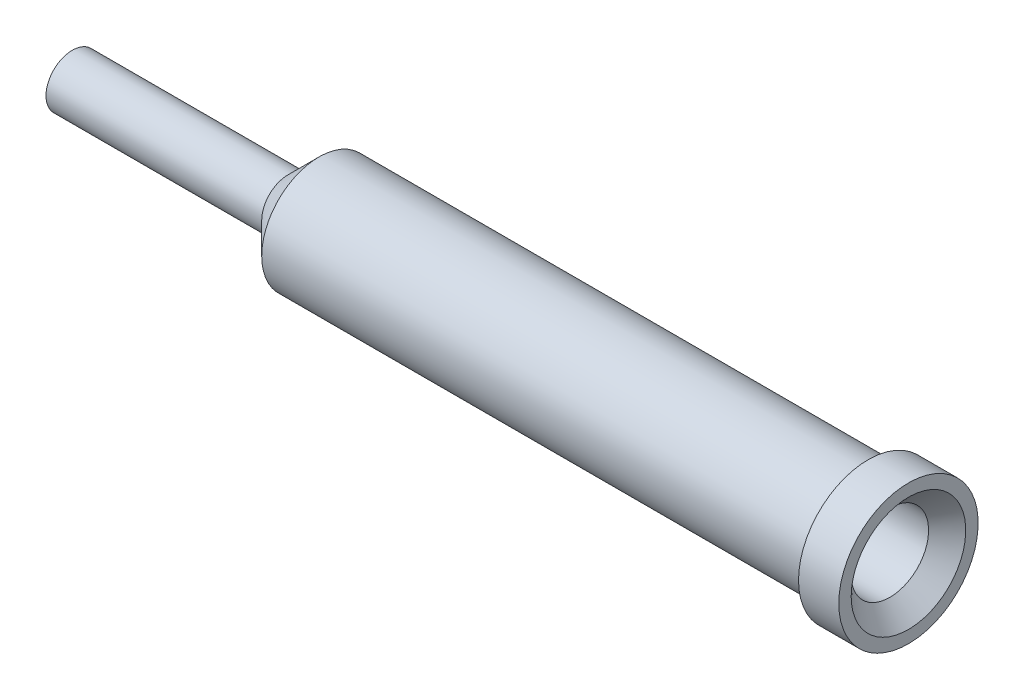
ISO-10303-21;
HEADER;
FILE_DESCRIPTION(('STEP AP214'),'2;1');
FILE_NAME('part.step','',(''),(''),'','','');
FILE_SCHEMA(('AUTOMOTIVE_DESIGN { 1 0 10303 214 1 1 1 1 }'));
ENDSEC;
DATA;
#1=APPLICATION_CONTEXT('core data for automotive mechanical design processes');
#2=APPLICATION_PROTOCOL_DEFINITION('international standard','automotive_design',2000,#1);
#3=PRODUCT_CONTEXT('',#1,'mechanical');
#4=PRODUCT('Part','Part','',(#3));
#5=PRODUCT_RELATED_PRODUCT_CATEGORY('part','',(#4));
#6=PRODUCT_DEFINITION_FORMATION('','',#4);
#7=PRODUCT_DEFINITION_CONTEXT('part definition',#1,'design');
#8=PRODUCT_DEFINITION('design','',#6,#7);
#9=PRODUCT_DEFINITION_SHAPE('','',#8);
#10=(LENGTH_UNIT() NAMED_UNIT(*) SI_UNIT(.MILLI.,.METRE.));
#11=(NAMED_UNIT(*) PLANE_ANGLE_UNIT() SI_UNIT($,.RADIAN.));
#12=(NAMED_UNIT(*) SI_UNIT($,.STERADIAN.) SOLID_ANGLE_UNIT());
#13=UNCERTAINTY_MEASURE_WITH_UNIT(LENGTH_MEASURE(1.E-05),#10,'distance_accuracy_value','');
#14=(GEOMETRIC_REPRESENTATION_CONTEXT(3) GLOBAL_UNCERTAINTY_ASSIGNED_CONTEXT((#13)) GLOBAL_UNIT_ASSIGNED_CONTEXT((#10,
#11,#12)) REPRESENTATION_CONTEXT('',''));
#15=CARTESIAN_POINT('',(0.,0.,0.));
#16=DIRECTION('',(0.,0.,1.));
#17=DIRECTION('',(1.,0.,0.));
#18=AXIS2_PLACEMENT_3D('',#15,#16,#17);
#19=CARTESIAN_POINT('',(-27.,0.,-0.85));
#20=DIRECTION('',(1.,0.,0.));
#21=DIRECTION('',(0.,0.,-1.));
#22=AXIS2_PLACEMENT_3D('',#19,#20,#21);
#23=PLANE('',#22);
#24=CARTESIAN_POINT('',(-27.,0.,0.));
#25=DIRECTION('',(-1.,0.,0.));
#26=DIRECTION('',(0.,0.,1.));
#27=AXIS2_PLACEMENT_3D('',#24,#25,#26);
#28=CIRCLE('',#27,0.45);
#29=CARTESIAN_POINT('',(-27.,0.,0.45));
#30=VERTEX_POINT('',#29);
#31=EDGE_CURVE('E11',#30,#30,#28,.T.);
#32=ORIENTED_EDGE('',*,*,#31,.F.);
#33=EDGE_LOOP('',(#32));
#34=FACE_BOUND('',#33,.T.);
#35=CARTESIAN_POINT('',(-27.,0.,0.));
#36=DIRECTION('',(-1.,0.,0.));
#37=DIRECTION('',(0.,0.,1.));
#38=AXIS2_PLACEMENT_3D('',#35,#36,#37);
#39=CIRCLE('',#38,0.85);
#40=CARTESIAN_POINT('',(-27.,0.,0.85));
#41=VERTEX_POINT('',#40);
#42=EDGE_CURVE('E69',#41,#41,#39,.T.);
#43=ORIENTED_EDGE('',*,*,#42,.T.);
#44=EDGE_LOOP('',(#43));
#45=FACE_BOUND('',#44,.T.);
#46=ADVANCED_FACE('F33',(#34,#45),#23,.F.);
#47=CARTESIAN_POINT('',(-52.1170922972491,0.,0.));
#48=DIRECTION('',(-1.,0.,0.));
#49=DIRECTION('',(0.,0.,1.));
#50=AXIS2_PLACEMENT_3D('',#47,#48,#49);
#51=CYLINDRICAL_SURFACE('',#50,0.45);
#52=CARTESIAN_POINT('',(-26.,0.,0.));
#53=DIRECTION('',(-1.,0.,0.));
#54=DIRECTION('',(0.,0.,1.));
#55=AXIS2_PLACEMENT_3D('',#52,#53,#54);
#56=CIRCLE('',#55,0.45);
#57=CARTESIAN_POINT('',(-26.,0.,0.45));
#58=VERTEX_POINT('',#57);
#59=EDGE_CURVE('E39',#58,#58,#56,.T.);
#60=ORIENTED_EDGE('',*,*,#59,.F.);
#61=EDGE_LOOP('',(#60));
#62=FACE_BOUND('',#61,.T.);
#63=ORIENTED_EDGE('',*,*,#31,.T.);
#64=EDGE_LOOP('',(#63));
#65=FACE_BOUND('',#64,.T.);
#66=ADVANCED_FACE('F55',(#62,#65),#51,.F.);
#67=CARTESIAN_POINT('',(-26.,0.,-0.45));
#68=DIRECTION('',(1.,0.,0.));
#69=DIRECTION('',(0.,0.,-1.));
#70=AXIS2_PLACEMENT_3D('',#67,#68,#69);
#71=PLANE('',#70);
#72=ORIENTED_EDGE('',*,*,#59,.T.);
#73=EDGE_LOOP('',(#72));
#74=FACE_BOUND('',#73,.T.);
#75=ADVANCED_FACE('F45',(#74),#71,.F.);
#76=CARTESIAN_POINT('',(-9.,0.,0.));
#77=DIRECTION('',(1.,0.,0.));
#78=DIRECTION('',(0.,0.,-1.));
#79=AXIS2_PLACEMENT_3D('',#76,#77,#78);
#80=CONICAL_SURFACE('',#79,0.,1.04719755119659);
#81=CARTESIAN_POINT('',(-8.27831216351296,0.,0.));
#82=DIRECTION('',(-1.,0.,0.));
#83=DIRECTION('',(0.,0.,1.));
#84=AXIS2_PLACEMENT_3D('',#81,#82,#83);
#85=CIRCLE('',#84,1.25);
#86=CARTESIAN_POINT('',(-8.27831216351296,0.,1.25));
#87=VERTEX_POINT('',#86);
#88=EDGE_CURVE('E94',#87,#87,#85,.T.);
#89=ORIENTED_EDGE('',*,*,#88,.F.);
#90=EDGE_LOOP('',(#89));
#91=FACE_BOUND('',#90,.T.);
#92=CARTESIAN_POINT('',(-9.,0.,0.));
#93=VERTEX_POINT('',#92);
#94=VERTEX_LOOP('',#93);
#95=FACE_BOUND('',#94,.T.);
#96=ADVANCED_FACE('F42',(#91,#95),#80,.F.);
#97=CARTESIAN_POINT('',(-52.1170922972491,0.,0.));
#98=DIRECTION('',(-1.,0.,0.));
#99=DIRECTION('',(0.,0.,1.));
#100=AXIS2_PLACEMENT_3D('',#97,#98,#99);
#101=CYLINDRICAL_SURFACE('',#100,1.25);
#102=CARTESIAN_POINT('',(-0.600000000000003,0.,0.));
#103=DIRECTION('',(-1.,0.,0.));
#104=DIRECTION('',(0.,0.,1.));
#105=AXIS2_PLACEMENT_3D('',#102,#103,#104);
#106=CIRCLE('',#105,1.25);
#107=CARTESIAN_POINT('',(-0.600000000000003,0.,1.25));
#108=VERTEX_POINT('',#107);
#109=EDGE_CURVE('E91',#108,#108,#106,.T.);
#110=ORIENTED_EDGE('',*,*,#109,.F.);
#111=EDGE_LOOP('',(#110));
#112=FACE_BOUND('',#111,.T.);
#113=ORIENTED_EDGE('',*,*,#88,.T.);
#114=EDGE_LOOP('',(#113));
#115=FACE_BOUND('',#114,.T.);
#116=ADVANCED_FACE('F44',(#112,#115),#101,.F.);
#117=CARTESIAN_POINT('',(-0.600000000000003,0.,0.));
#118=DIRECTION('',(1.,0.,0.));
#119=DIRECTION('',(0.,0.,-1.));
#120=AXIS2_PLACEMENT_3D('',#117,#118,#119);
#121=CONICAL_SURFACE('',#120,1.25,0.785398163397446);
#122=CARTESIAN_POINT('',(0.,0.,0.));
#123=DIRECTION('',(-1.,0.,0.));
#124=DIRECTION('',(0.,0.,1.));
#125=AXIS2_PLACEMENT_3D('',#122,#123,#124);
#126=CIRCLE('',#125,1.85);
#127=CARTESIAN_POINT('',(0.,0.,1.85));
#128=VERTEX_POINT('',#127);
#129=EDGE_CURVE('E88',#128,#128,#126,.T.);
#130=ORIENTED_EDGE('',*,*,#129,.F.);
#131=EDGE_LOOP('',(#130));
#132=FACE_BOUND('',#131,.T.);
#133=ORIENTED_EDGE('',*,*,#109,.T.);
#134=EDGE_LOOP('',(#133));
#135=FACE_BOUND('',#134,.T.);
#136=ADVANCED_FACE('F52',(#132,#135),#121,.F.);
#137=CARTESIAN_POINT('',(0.,0.,-2.25));
#138=DIRECTION('',(-1.,0.,0.));
#139=DIRECTION('',(0.,0.,1.));
#140=AXIS2_PLACEMENT_3D('',#137,#138,#139);
#141=PLANE('',#140);
#142=CARTESIAN_POINT('',(0.,0.,0.));
#143=DIRECTION('',(-1.,0.,0.));
#144=DIRECTION('',(0.,0.,1.));
#145=AXIS2_PLACEMENT_3D('',#142,#143,#144);
#146=CIRCLE('',#145,2.25);
#147=CARTESIAN_POINT('',(0.,0.,2.25));
#148=VERTEX_POINT('',#147);
#149=EDGE_CURVE('E85',#148,#148,#146,.T.);
#150=ORIENTED_EDGE('',*,*,#149,.F.);
#151=EDGE_LOOP('',(#150));
#152=FACE_BOUND('',#151,.T.);
#153=ORIENTED_EDGE('',*,*,#129,.T.);
#154=EDGE_LOOP('',(#153));
#155=FACE_BOUND('',#154,.T.);
#156=ADVANCED_FACE('F103',(#152,#155),#141,.F.);
#157=CARTESIAN_POINT('',(-52.1170922972491,0.,0.));
#158=DIRECTION('',(-1.,0.,0.));
#159=DIRECTION('',(0.,0.,1.));
#160=AXIS2_PLACEMENT_3D('',#157,#158,#159);
#161=CYLINDRICAL_SURFACE('',#160,2.25);
#162=CARTESIAN_POINT('',(-1.3,0.,0.));
#163=DIRECTION('',(-1.,0.,0.));
#164=DIRECTION('',(0.,0.,1.));
#165=AXIS2_PLACEMENT_3D('',#162,#163,#164);
#166=CIRCLE('',#165,2.25);
#167=CARTESIAN_POINT('',(-1.3,0.,2.25));
#168=VERTEX_POINT('',#167);
#169=EDGE_CURVE('E82',#168,#168,#166,.T.);
#170=ORIENTED_EDGE('',*,*,#169,.F.);
#171=EDGE_LOOP('',(#170));
#172=FACE_BOUND('',#171,.T.);
#173=ORIENTED_EDGE('',*,*,#149,.T.);
#174=EDGE_LOOP('',(#173));
#175=FACE_BOUND('',#174,.T.);
#176=ADVANCED_FACE('F109',(#172,#175),#161,.T.);
#177=CARTESIAN_POINT('',(-1.3,0.,-1.85));
#178=DIRECTION('',(1.,0.,0.));
#179=DIRECTION('',(0.,0.,-1.));
#180=AXIS2_PLACEMENT_3D('',#177,#178,#179);
#181=PLANE('',#180);
#182=CARTESIAN_POINT('',(-1.3,0.,0.));
#183=DIRECTION('',(-1.,0.,0.));
#184=DIRECTION('',(0.,0.,1.));
#185=AXIS2_PLACEMENT_3D('',#182,#183,#184);
#186=CIRCLE('',#185,1.85);
#187=CARTESIAN_POINT('',(-1.3,0.,1.85));
#188=VERTEX_POINT('',#187);
#189=EDGE_CURVE('E79',#188,#188,#186,.T.);
#190=ORIENTED_EDGE('',*,*,#189,.F.);
#191=EDGE_LOOP('',(#190));
#192=FACE_BOUND('',#191,.T.);
#193=ORIENTED_EDGE('',*,*,#169,.T.);
#194=EDGE_LOOP('',(#193));
#195=FACE_BOUND('',#194,.T.);
#196=ADVANCED_FACE('F116',(#192,#195),#181,.F.);
#197=CARTESIAN_POINT('',(-52.1170922972491,0.,0.));
#198=DIRECTION('',(-1.,0.,0.));
#199=DIRECTION('',(0.,0.,1.));
#200=AXIS2_PLACEMENT_3D('',#197,#198,#199);
#201=CYLINDRICAL_SURFACE('',#200,1.85);
#202=CARTESIAN_POINT('',(-19.0343145750508,0.,0.));
#203=DIRECTION('',(-1.,0.,0.));
#204=DIRECTION('',(0.,0.,1.));
#205=AXIS2_PLACEMENT_3D('',#202,#203,#204);
#206=CIRCLE('',#205,1.85);
#207=CARTESIAN_POINT('',(-19.0343145750508,0.,1.85));
#208=VERTEX_POINT('',#207);
#209=EDGE_CURVE('E74',#208,#208,#206,.T.);
#210=ORIENTED_EDGE('',*,*,#209,.F.);
#211=EDGE_LOOP('',(#210));
#212=FACE_BOUND('',#211,.T.);
#213=ORIENTED_EDGE('',*,*,#189,.T.);
#214=EDGE_LOOP('',(#213));
#215=FACE_BOUND('',#214,.T.);
#216=ADVANCED_FACE('F120',(#212,#215),#201,.T.);
#217=CARTESIAN_POINT('',(-19.0343145750508,0.,0.));
#218=DIRECTION('',(1.,0.,0.));
#219=DIRECTION('',(0.,0.,-1.));
#220=AXIS2_PLACEMENT_3D('',#217,#218,#219);
#221=CONICAL_SURFACE('',#220,1.85,0.785398163397451);
#222=CARTESIAN_POINT('',(-20.0343145750508,0.,0.));
#223=DIRECTION('',(-1.,0.,0.));
#224=DIRECTION('',(0.,0.,1.));
#225=AXIS2_PLACEMENT_3D('',#222,#223,#224);
#226=CIRCLE('',#225,0.85);
#227=CARTESIAN_POINT('',(-20.0343145750508,0.,0.85));
#228=VERTEX_POINT('',#227);
#229=EDGE_CURVE('E71',#228,#228,#226,.T.);
#230=ORIENTED_EDGE('',*,*,#229,.F.);
#231=EDGE_LOOP('',(#230));
#232=FACE_BOUND('',#231,.T.);
#233=ORIENTED_EDGE('',*,*,#209,.T.);
#234=EDGE_LOOP('',(#233));
#235=FACE_BOUND('',#234,.T.);
#236=ADVANCED_FACE('F124',(#232,#235),#221,.T.);
#237=CARTESIAN_POINT('',(-52.1170922972491,0.,0.));
#238=DIRECTION('',(-1.,0.,0.));
#239=DIRECTION('',(0.,0.,1.));
#240=AXIS2_PLACEMENT_3D('',#237,#238,#239);
#241=CYLINDRICAL_SURFACE('',#240,0.85);
#242=ORIENTED_EDGE('',*,*,#42,.F.);
#243=EDGE_LOOP('',(#242));
#244=FACE_BOUND('',#243,.T.);
#245=ORIENTED_EDGE('',*,*,#229,.T.);
#246=EDGE_LOOP('',(#245));
#247=FACE_BOUND('',#246,.T.);
#248=ADVANCED_FACE('F128',(#244,#247),#241,.T.);
#249=CLOSED_SHELL('',(#46,#66,#75,#96,#116,#136,#156,#176,#196,#216,#236,#248));
#250=MANIFOLD_SOLID_BREP('B2',#249);
#251=ADVANCED_BREP_SHAPE_REPRESENTATION('',(#18,#250),#14);
#252=SHAPE_DEFINITION_REPRESENTATION(#9,#251);
ENDSEC;
END-ISO-10303-21;
